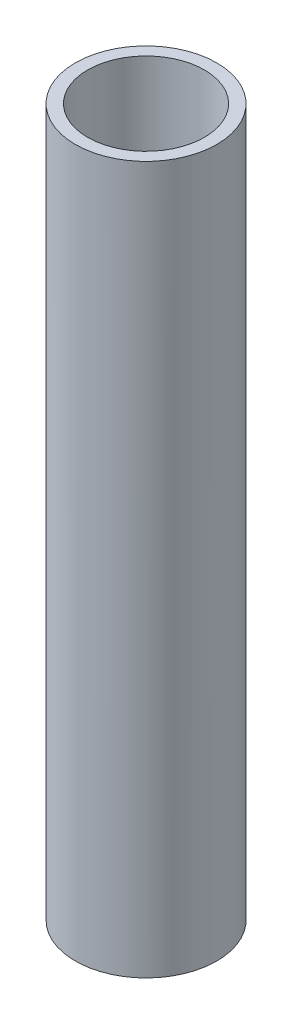
ISO-10303-21;
HEADER;
FILE_DESCRIPTION(('STEP AP214'),'2;1');
FILE_NAME('part.step','',(''),(''),'','','');
FILE_SCHEMA(('AUTOMOTIVE_DESIGN { 1 0 10303 214 1 1 1 1 }'));
ENDSEC;
DATA;
#1=APPLICATION_CONTEXT('core data for automotive mechanical design processes');
#2=APPLICATION_PROTOCOL_DEFINITION('international standard','automotive_design',2000,#1);
#3=PRODUCT_CONTEXT('',#1,'mechanical');
#4=PRODUCT('Part','Part','',(#3));
#5=PRODUCT_RELATED_PRODUCT_CATEGORY('part','',(#4));
#6=PRODUCT_DEFINITION_FORMATION('','',#4);
#7=PRODUCT_DEFINITION_CONTEXT('part definition',#1,'design');
#8=PRODUCT_DEFINITION('design','',#6,#7);
#9=PRODUCT_DEFINITION_SHAPE('','',#8);
#10=(LENGTH_UNIT() NAMED_UNIT(*) SI_UNIT(.MILLI.,.METRE.));
#11=(NAMED_UNIT(*) PLANE_ANGLE_UNIT() SI_UNIT($,.RADIAN.));
#12=(NAMED_UNIT(*) SI_UNIT($,.STERADIAN.) SOLID_ANGLE_UNIT());
#13=UNCERTAINTY_MEASURE_WITH_UNIT(LENGTH_MEASURE(1.E-05),#10,'distance_accuracy_value','');
#14=(GEOMETRIC_REPRESENTATION_CONTEXT(3) GLOBAL_UNCERTAINTY_ASSIGNED_CONTEXT((#13)) GLOBAL_UNIT_ASSIGNED_CONTEXT((#10,
#11,#12)) REPRESENTATION_CONTEXT('',''));
#15=CARTESIAN_POINT('',(0.,0.,0.));
#16=DIRECTION('',(0.,0.,1.));
#17=DIRECTION('',(1.,0.,0.));
#18=AXIS2_PLACEMENT_3D('',#15,#16,#17);
#19=CARTESIAN_POINT('',(0.,146.05,0.));
#20=DIRECTION('',(0.,1.,0.));
#21=DIRECTION('',(0.,0.,1.));
#22=AXIS2_PLACEMENT_3D('',#19,#20,#21);
#23=PLANE('',#22);
#24=CARTESIAN_POINT('',(0.,146.05,0.));
#25=DIRECTION('',(0.,1.,0.));
#26=DIRECTION('',(0.,0.,1.));
#27=AXIS2_PLACEMENT_3D('',#24,#25,#26);
#28=CIRCLE('',#27,14.605);
#29=CARTESIAN_POINT('',(0.,146.05,14.605));
#30=VERTEX_POINT('',#29);
#31=EDGE_CURVE('E96',#30,#30,#28,.T.);
#32=ORIENTED_EDGE('',*,*,#31,.T.);
#33=EDGE_LOOP('',(#32));
#34=FACE_BOUND('',#33,.T.);
#35=CARTESIAN_POINT('',(0.,146.05,0.));
#36=DIRECTION('',(0.,1.,0.));
#37=DIRECTION('',(0.,0.,1.));
#38=AXIS2_PLACEMENT_3D('',#35,#36,#37);
#39=CIRCLE('',#38,12.065);
#40=CARTESIAN_POINT('',(0.,146.05,12.065));
#41=VERTEX_POINT('',#40);
#42=EDGE_CURVE('E97',#41,#41,#39,.T.);
#43=ORIENTED_EDGE('',*,*,#42,.F.);
#44=EDGE_LOOP('',(#43));
#45=FACE_BOUND('',#44,.T.);
#46=ADVANCED_FACE('F37',(#34,#45),#23,.T.);
#47=CARTESIAN_POINT('',(0.,0.,0.));
#48=DIRECTION('',(0.,1.,0.));
#49=DIRECTION('',(0.,0.,1.));
#50=AXIS2_PLACEMENT_3D('',#47,#48,#49);
#51=PLANE('',#50);
#52=CARTESIAN_POINT('',(0.,0.,0.));
#53=DIRECTION('',(0.,1.,0.));
#54=DIRECTION('',(0.,0.,1.));
#55=AXIS2_PLACEMENT_3D('',#52,#53,#54);
#56=CIRCLE('',#55,14.605);
#57=CARTESIAN_POINT('',(-1.778,0.,-14.4963699249157));
#58=VERTEX_POINT('',#57);
#59=CARTESIAN_POINT('',(1.778,0.,-14.4963699249157));
#60=VERTEX_POINT('',#59);
#61=EDGE_CURVE('E91',#58,#60,#56,.T.);
#62=ORIENTED_EDGE('',*,*,#61,.F.);
#63=DIRECTION('',(0.,0.,1.));
#64=VECTOR('',#63,1.);
#65=CARTESIAN_POINT('',(-1.778,0.,-25.4));
#66=LINE('',#65,#64);
#67=CARTESIAN_POINT('',(-1.778,0.,-11.9332703396848));
#68=VERTEX_POINT('',#67);
#69=EDGE_CURVE('E77',#58,#68,#66,.T.);
#70=ORIENTED_EDGE('',*,*,#69,.T.);
#71=CARTESIAN_POINT('',(0.,0.,0.));
#72=DIRECTION('',(0.,1.,0.));
#73=DIRECTION('',(0.,0.,1.));
#74=AXIS2_PLACEMENT_3D('',#71,#72,#73);
#75=CIRCLE('',#74,12.065);
#76=CARTESIAN_POINT('',(1.778,0.,-11.9332703396848));
#77=VERTEX_POINT('',#76);
#78=EDGE_CURVE('E93',#68,#77,#75,.T.);
#79=ORIENTED_EDGE('',*,*,#78,.T.);
#80=DIRECTION('',(0.,0.,1.));
#81=VECTOR('',#80,1.);
#82=CARTESIAN_POINT('',(1.778,0.,-25.4));
#83=LINE('',#82,#81);
#84=EDGE_CURVE('E52',#60,#77,#83,.T.);
#85=ORIENTED_EDGE('',*,*,#84,.F.);
#86=EDGE_LOOP('',(#62,#70,#79,#85));
#87=FACE_BOUND('',#86,.T.);
#88=ADVANCED_FACE('F95',(#87),#51,.F.);
#89=CARTESIAN_POINT('',(0.,146.05,0.));
#90=DIRECTION('',(0.,-1.,0.));
#91=DIRECTION('',(0.,0.,-1.));
#92=AXIS2_PLACEMENT_3D('',#89,#90,#91);
#93=CYLINDRICAL_SURFACE('',#92,14.605);
#94=ORIENTED_EDGE('',*,*,#31,.F.);
#95=EDGE_LOOP('',(#94));
#96=FACE_BOUND('',#95,.T.);
#97=CARTESIAN_POINT('',(0.,25.4,0.));
#98=DIRECTION('',(0.,1.,0.));
#99=DIRECTION('',(0.,0.,1.));
#100=AXIS2_PLACEMENT_3D('',#97,#98,#99);
#101=CIRCLE('',#100,14.605);
#102=CARTESIAN_POINT('',(1.778,25.4,-14.4963699249157));
#103=VERTEX_POINT('',#102);
#104=CARTESIAN_POINT('',(-1.778,25.4,-14.4963699249157));
#105=VERTEX_POINT('',#104);
#106=EDGE_CURVE('E92',#103,#105,#101,.T.);
#107=ORIENTED_EDGE('',*,*,#106,.T.);
#108=DIRECTION('',(0.,-1.,0.));
#109=VECTOR('',#108,1.);
#110=CARTESIAN_POINT('',(-1.778,146.05,-14.4963699249157));
#111=LINE('',#110,#109);
#112=EDGE_CURVE('E80',#105,#58,#111,.T.);
#113=ORIENTED_EDGE('',*,*,#112,.T.);
#114=ORIENTED_EDGE('',*,*,#61,.T.);
#115=DIRECTION('',(0.,-1.,0.));
#116=VECTOR('',#115,1.);
#117=CARTESIAN_POINT('',(1.778,146.05,-14.4963699249157));
#118=LINE('',#117,#116);
#119=EDGE_CURVE('E117',#60,#103,#118,.F.);
#120=ORIENTED_EDGE('',*,*,#119,.T.);
#121=EDGE_LOOP('',(#107,#113,#114,#120));
#122=FACE_BOUND('',#121,.T.);
#123=ADVANCED_FACE('F39',(#96,#122),#93,.T.);
#124=CARTESIAN_POINT('',(0.,146.05,0.));
#125=DIRECTION('',(0.,-1.,0.));
#126=DIRECTION('',(0.,0.,-1.));
#127=AXIS2_PLACEMENT_3D('',#124,#125,#126);
#128=CYLINDRICAL_SURFACE('',#127,12.065);
#129=DIRECTION('',(0.,-1.,0.));
#130=VECTOR('',#129,1.);
#131=CARTESIAN_POINT('',(-1.778,146.05,-11.9332703396848));
#132=LINE('',#131,#130);
#133=CARTESIAN_POINT('',(-1.778,25.4,-11.9332703396848));
#134=VERTEX_POINT('',#133);
#135=EDGE_CURVE('E11',#134,#68,#132,.T.);
#136=ORIENTED_EDGE('',*,*,#135,.F.);
#137=CARTESIAN_POINT('',(0.,25.4,0.));
#138=DIRECTION('',(0.,1.,0.));
#139=DIRECTION('',(0.,0.,1.));
#140=AXIS2_PLACEMENT_3D('',#137,#138,#139);
#141=CIRCLE('',#140,12.065);
#142=CARTESIAN_POINT('',(1.778,25.4,-11.9332703396848));
#143=VERTEX_POINT('',#142);
#144=EDGE_CURVE('E45',#143,#134,#141,.T.);
#145=ORIENTED_EDGE('',*,*,#144,.F.);
#146=DIRECTION('',(0.,-1.,0.));
#147=VECTOR('',#146,1.);
#148=CARTESIAN_POINT('',(1.778,146.05,-11.9332703396848));
#149=LINE('',#148,#147);
#150=EDGE_CURVE('E100',#77,#143,#149,.F.);
#151=ORIENTED_EDGE('',*,*,#150,.F.);
#152=ORIENTED_EDGE('',*,*,#78,.F.);
#153=EDGE_LOOP('',(#136,#145,#151,#152));
#154=FACE_BOUND('',#153,.T.);
#155=ORIENTED_EDGE('',*,*,#42,.T.);
#156=EDGE_LOOP('',(#155));
#157=FACE_BOUND('',#156,.T.);
#158=ADVANCED_FACE('F113',(#154,#157),#128,.F.);
#159=CARTESIAN_POINT('',(-1.778,0.,-25.4));
#160=DIRECTION('',(-1.,0.,0.));
#161=DIRECTION('',(0.,0.,1.));
#162=AXIS2_PLACEMENT_3D('',#159,#160,#161);
#163=PLANE('',#162);
#164=DIRECTION('',(0.,0.,1.));
#165=VECTOR('',#164,1.);
#166=CARTESIAN_POINT('',(-1.778,25.4,-25.4));
#167=LINE('',#166,#165);
#168=EDGE_CURVE('E111',#105,#134,#167,.T.);
#169=ORIENTED_EDGE('',*,*,#168,.T.);
#170=ORIENTED_EDGE('',*,*,#135,.T.);
#171=ORIENTED_EDGE('',*,*,#69,.F.);
#172=ORIENTED_EDGE('',*,*,#112,.F.);
#173=EDGE_LOOP('',(#169,#170,#171,#172));
#174=FACE_BOUND('',#173,.T.);
#175=ADVANCED_FACE('F79',(#174),#163,.F.);
#176=CARTESIAN_POINT('',(-1.778,25.4,-25.4));
#177=DIRECTION('',(0.,1.,0.));
#178=DIRECTION('',(0.,0.,1.));
#179=AXIS2_PLACEMENT_3D('',#176,#177,#178);
#180=PLANE('',#179);
#181=DIRECTION('',(0.,0.,1.));
#182=VECTOR('',#181,1.);
#183=CARTESIAN_POINT('',(1.778,25.4,-25.4));
#184=LINE('',#183,#182);
#185=EDGE_CURVE('E108',#103,#143,#184,.T.);
#186=ORIENTED_EDGE('',*,*,#185,.T.);
#187=ORIENTED_EDGE('',*,*,#144,.T.);
#188=ORIENTED_EDGE('',*,*,#168,.F.);
#189=ORIENTED_EDGE('',*,*,#106,.F.);
#190=EDGE_LOOP('',(#186,#187,#188,#189));
#191=FACE_BOUND('',#190,.T.);
#192=ADVANCED_FACE('F110',(#191),#180,.F.);
#193=CARTESIAN_POINT('',(1.778,0.,-25.4));
#194=DIRECTION('',(1.,0.,0.));
#195=DIRECTION('',(0.,0.,-1.));
#196=AXIS2_PLACEMENT_3D('',#193,#194,#195);
#197=PLANE('',#196);
#198=ORIENTED_EDGE('',*,*,#84,.T.);
#199=ORIENTED_EDGE('',*,*,#150,.T.);
#200=ORIENTED_EDGE('',*,*,#185,.F.);
#201=ORIENTED_EDGE('',*,*,#119,.F.);
#202=EDGE_LOOP('',(#198,#199,#200,#201));
#203=FACE_BOUND('',#202,.T.);
#204=ADVANCED_FACE('F107',(#203),#197,.F.);
#205=CLOSED_SHELL('',(#46,#88,#123,#158,#175,#192,#204));
#206=MANIFOLD_SOLID_BREP('B2',#205);
#207=ADVANCED_BREP_SHAPE_REPRESENTATION('',(#18,#206),#14);
#208=SHAPE_DEFINITION_REPRESENTATION(#9,#207);
ENDSEC;
END-ISO-10303-21;
